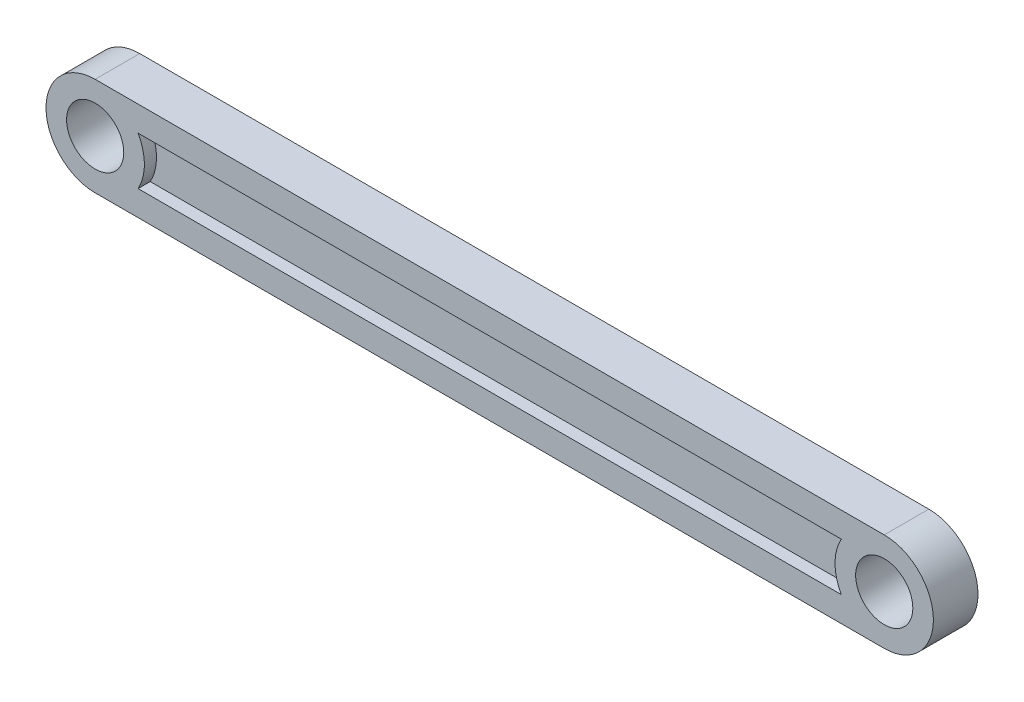
ISO-10303-21;
HEADER;
FILE_DESCRIPTION(('STEP AP214'),'2;1');
FILE_NAME('part.step','',(''),(''),'','','');
FILE_SCHEMA(('AUTOMOTIVE_DESIGN { 1 0 10303 214 1 1 1 1 }'));
ENDSEC;
DATA;
#1=APPLICATION_CONTEXT('core data for automotive mechanical design processes');
#2=APPLICATION_PROTOCOL_DEFINITION('international standard','automotive_design',2000,#1);
#3=PRODUCT_CONTEXT('',#1,'mechanical');
#4=PRODUCT('Part','Part','',(#3));
#5=PRODUCT_RELATED_PRODUCT_CATEGORY('part','',(#4));
#6=PRODUCT_DEFINITION_FORMATION('','',#4);
#7=PRODUCT_DEFINITION_CONTEXT('part definition',#1,'design');
#8=PRODUCT_DEFINITION('design','',#6,#7);
#9=PRODUCT_DEFINITION_SHAPE('','',#8);
#10=(LENGTH_UNIT() NAMED_UNIT(*) SI_UNIT(.MILLI.,.METRE.));
#11=(NAMED_UNIT(*) PLANE_ANGLE_UNIT() SI_UNIT($,.RADIAN.));
#12=(NAMED_UNIT(*) SI_UNIT($,.STERADIAN.) SOLID_ANGLE_UNIT());
#13=UNCERTAINTY_MEASURE_WITH_UNIT(LENGTH_MEASURE(1.E-05),#10,'distance_accuracy_value','');
#14=(GEOMETRIC_REPRESENTATION_CONTEXT(3) GLOBAL_UNCERTAINTY_ASSIGNED_CONTEXT((#13)) GLOBAL_UNIT_ASSIGNED_CONTEXT((#10,
#11,#12)) REPRESENTATION_CONTEXT('',''));
#15=CARTESIAN_POINT('',(0.,0.,0.));
#16=DIRECTION('',(0.,0.,1.));
#17=DIRECTION('',(1.,0.,0.));
#18=AXIS2_PLACEMENT_3D('',#15,#16,#17);
#19=CARTESIAN_POINT('',(34.5,0.,1.95));
#20=DIRECTION('',(0.,0.,1.));
#21=DIRECTION('',(1.,0.,0.));
#22=AXIS2_PLACEMENT_3D('',#19,#20,#21);
#23=PLANE('',#22);
#24=CARTESIAN_POINT('',(-34.5,0.,1.95));
#25=DIRECTION('',(0.,0.,1.));
#26=DIRECTION('',(1.,0.,0.));
#27=AXIS2_PLACEMENT_3D('',#24,#25,#26);
#28=CIRCLE('',#27,2.5);
#29=CARTESIAN_POINT('',(-32.,0.,1.95));
#30=VERTEX_POINT('',#29);
#31=EDGE_CURVE('E227',#30,#30,#28,.T.);
#32=ORIENTED_EDGE('',*,*,#31,.F.);
#33=EDGE_LOOP('',(#32));
#34=FACE_BOUND('',#33,.T.);
#35=CARTESIAN_POINT('',(34.5,0.,1.95));
#36=DIRECTION('',(0.,0.,1.));
#37=DIRECTION('',(1.,0.,0.));
#38=AXIS2_PLACEMENT_3D('',#35,#36,#37);
#39=CIRCLE('',#38,4.3);
#40=CARTESIAN_POINT('',(34.5,-4.29999999999999,1.95));
#41=VERTEX_POINT('',#40);
#42=CARTESIAN_POINT('',(34.5,4.30000000000001,1.95));
#43=VERTEX_POINT('',#42);
#44=EDGE_CURVE('E235',#41,#43,#39,.T.);
#45=ORIENTED_EDGE('',*,*,#44,.T.);
#46=DIRECTION('',(-1.,0.,0.));
#47=VECTOR('',#46,1.);
#48=CARTESIAN_POINT('',(34.5,4.30000000000001,1.95));
#49=LINE('',#48,#47);
#50=CARTESIAN_POINT('',(-34.5,4.29999999999999,1.95));
#51=VERTEX_POINT('',#50);
#52=EDGE_CURVE('E239',#43,#51,#49,.T.);
#53=ORIENTED_EDGE('',*,*,#52,.T.);
#54=CARTESIAN_POINT('',(-34.5,0.,1.95));
#55=DIRECTION('',(0.,0.,1.));
#56=DIRECTION('',(1.,0.,0.));
#57=AXIS2_PLACEMENT_3D('',#54,#55,#56);
#58=CIRCLE('',#57,4.3);
#59=CARTESIAN_POINT('',(-34.5,-4.30000000000001,1.95));
#60=VERTEX_POINT('',#59);
#61=EDGE_CURVE('E243',#51,#60,#58,.T.);
#62=ORIENTED_EDGE('',*,*,#61,.T.);
#63=DIRECTION('',(1.,0.,0.));
#64=VECTOR('',#63,1.);
#65=CARTESIAN_POINT('',(34.5,-4.29999999999999,1.95));
#66=LINE('',#65,#64);
#67=EDGE_CURVE('E246',#60,#41,#66,.T.);
#68=ORIENTED_EDGE('',*,*,#67,.T.);
#69=EDGE_LOOP('',(#45,#53,#62,#68));
#70=FACE_BOUND('',#69,.T.);
#71=CARTESIAN_POINT('',(34.5,0.,1.95));
#72=DIRECTION('',(0.,0.,1.));
#73=DIRECTION('',(1.,0.,0.));
#74=AXIS2_PLACEMENT_3D('',#71,#72,#73);
#75=CIRCLE('',#74,2.5);
#76=CARTESIAN_POINT('',(37.,0.,1.95));
#77=VERTEX_POINT('',#76);
#78=EDGE_CURVE('E219',#77,#77,#75,.T.);
#79=ORIENTED_EDGE('',*,*,#78,.F.);
#80=EDGE_LOOP('',(#79));
#81=FACE_BOUND('',#80,.T.);
#82=DIRECTION('',(-1.,0.,0.));
#83=VECTOR('',#82,1.);
#84=CARTESIAN_POINT('',(0.,2.1,1.95));
#85=LINE('',#84,#83);
#86=CARTESIAN_POINT('',(30.7476673921413,2.10000000000001,1.95));
#87=VERTEX_POINT('',#86);
#88=CARTESIAN_POINT('',(-30.7476673921413,2.09999999999999,1.95));
#89=VERTEX_POINT('',#88);
#90=EDGE_CURVE('E196',#87,#89,#85,.T.);
#91=ORIENTED_EDGE('',*,*,#90,.F.);
#92=CARTESIAN_POINT('',(34.5,0.,1.95));
#93=DIRECTION('',(0.,0.,1.));
#94=DIRECTION('',(1.,0.,0.));
#95=AXIS2_PLACEMENT_3D('',#92,#93,#94);
#96=CIRCLE('',#95,4.3);
#97=CARTESIAN_POINT('',(30.7476673921413,-2.09999999999999,1.95));
#98=VERTEX_POINT('',#97);
#99=EDGE_CURVE('E63',#87,#98,#96,.T.);
#100=ORIENTED_EDGE('',*,*,#99,.T.);
#101=DIRECTION('',(1.,0.,0.));
#102=VECTOR('',#101,1.);
#103=CARTESIAN_POINT('',(0.,-2.1,1.95));
#104=LINE('',#103,#102);
#105=CARTESIAN_POINT('',(-30.7476673921413,-2.10000000000001,1.95));
#106=VERTEX_POINT('',#105);
#107=EDGE_CURVE('E182',#106,#98,#104,.T.);
#108=ORIENTED_EDGE('',*,*,#107,.F.);
#109=CARTESIAN_POINT('',(-34.5,0.,1.95));
#110=DIRECTION('',(0.,0.,1.));
#111=DIRECTION('',(1.,0.,0.));
#112=AXIS2_PLACEMENT_3D('',#109,#110,#111);
#113=CIRCLE('',#112,4.3);
#114=EDGE_CURVE('E200',#106,#89,#113,.T.);
#115=ORIENTED_EDGE('',*,*,#114,.T.);
#116=EDGE_LOOP('',(#91,#100,#108,#115));
#117=FACE_BOUND('',#116,.T.);
#118=ADVANCED_FACE('F39',(#34,#70,#81,#117),#23,.T.);
#119=CARTESIAN_POINT('',(34.5,0.,-1.95));
#120=DIRECTION('',(0.,0.,1.));
#121=DIRECTION('',(1.,0.,0.));
#122=AXIS2_PLACEMENT_3D('',#119,#120,#121);
#123=PLANE('',#122);
#124=DIRECTION('',(1.,0.,0.));
#125=VECTOR('',#124,1.);
#126=CARTESIAN_POINT('',(0.,-2.1,-1.95));
#127=LINE('',#126,#125);
#128=CARTESIAN_POINT('',(-30.7476673921413,-2.10000000000001,-1.95));
#129=VERTEX_POINT('',#128);
#130=CARTESIAN_POINT('',(30.7476673921413,-2.09999999999999,-1.95));
#131=VERTEX_POINT('',#130);
#132=EDGE_CURVE('E164',#129,#131,#127,.T.);
#133=ORIENTED_EDGE('',*,*,#132,.T.);
#134=CARTESIAN_POINT('',(34.5,0.,-1.95));
#135=DIRECTION('',(0.,0.,1.));
#136=DIRECTION('',(1.,0.,0.));
#137=AXIS2_PLACEMENT_3D('',#134,#135,#136);
#138=CIRCLE('',#137,4.3);
#139=CARTESIAN_POINT('',(30.7476673921413,2.10000000000001,-1.95));
#140=VERTEX_POINT('',#139);
#141=EDGE_CURVE('E55',#140,#131,#138,.T.);
#142=ORIENTED_EDGE('',*,*,#141,.F.);
#143=DIRECTION('',(-1.,0.,0.));
#144=VECTOR('',#143,1.);
#145=CARTESIAN_POINT('',(0.,2.1,-1.95));
#146=LINE('',#145,#144);
#147=CARTESIAN_POINT('',(-30.7476673921413,2.09999999999999,-1.95));
#148=VERTEX_POINT('',#147);
#149=EDGE_CURVE('E151',#140,#148,#146,.T.);
#150=ORIENTED_EDGE('',*,*,#149,.T.);
#151=CARTESIAN_POINT('',(-34.5,0.,-1.95));
#152=DIRECTION('',(0.,0.,1.));
#153=DIRECTION('',(1.,0.,0.));
#154=AXIS2_PLACEMENT_3D('',#151,#152,#153);
#155=CIRCLE('',#154,4.3);
#156=EDGE_CURVE('E155',#129,#148,#155,.T.);
#157=ORIENTED_EDGE('',*,*,#156,.F.);
#158=EDGE_LOOP('',(#133,#142,#150,#157));
#159=FACE_BOUND('',#158,.T.);
#160=CARTESIAN_POINT('',(34.5,0.,-1.95));
#161=DIRECTION('',(0.,0.,1.));
#162=DIRECTION('',(1.,0.,0.));
#163=AXIS2_PLACEMENT_3D('',#160,#161,#162);
#164=CIRCLE('',#163,4.3);
#165=CARTESIAN_POINT('',(34.5,-4.29999999999999,-1.95));
#166=VERTEX_POINT('',#165);
#167=CARTESIAN_POINT('',(34.5,4.30000000000001,-1.95));
#168=VERTEX_POINT('',#167);
#169=EDGE_CURVE('E231',#166,#168,#164,.T.);
#170=ORIENTED_EDGE('',*,*,#169,.F.);
#171=DIRECTION('',(1.,0.,0.));
#172=VECTOR('',#171,1.);
#173=CARTESIAN_POINT('',(34.5,-4.29999999999999,-1.95));
#174=LINE('',#173,#172);
#175=CARTESIAN_POINT('',(-34.5,-4.30000000000001,-1.95));
#176=VERTEX_POINT('',#175);
#177=EDGE_CURVE('E240',#176,#166,#174,.T.);
#178=ORIENTED_EDGE('',*,*,#177,.F.);
#179=CARTESIAN_POINT('',(-34.5,0.,-1.95));
#180=DIRECTION('',(0.,0.,1.));
#181=DIRECTION('',(1.,0.,0.));
#182=AXIS2_PLACEMENT_3D('',#179,#180,#181);
#183=CIRCLE('',#182,4.3);
#184=CARTESIAN_POINT('',(-34.5,4.29999999999999,-1.95));
#185=VERTEX_POINT('',#184);
#186=EDGE_CURVE('E256',#185,#176,#183,.T.);
#187=ORIENTED_EDGE('',*,*,#186,.F.);
#188=DIRECTION('',(-1.,0.,0.));
#189=VECTOR('',#188,1.);
#190=CARTESIAN_POINT('',(34.5,4.30000000000001,-1.95));
#191=LINE('',#190,#189);
#192=EDGE_CURVE('E253',#168,#185,#191,.T.);
#193=ORIENTED_EDGE('',*,*,#192,.F.);
#194=EDGE_LOOP('',(#170,#178,#187,#193));
#195=FACE_BOUND('',#194,.T.);
#196=CARTESIAN_POINT('',(-34.5,0.,-1.95));
#197=DIRECTION('',(0.,0.,1.));
#198=DIRECTION('',(1.,0.,0.));
#199=AXIS2_PLACEMENT_3D('',#196,#197,#198);
#200=CIRCLE('',#199,2.5);
#201=CARTESIAN_POINT('',(-32.,0.,-1.95));
#202=VERTEX_POINT('',#201);
#203=EDGE_CURVE('E223',#202,#202,#200,.T.);
#204=ORIENTED_EDGE('',*,*,#203,.T.);
#205=EDGE_LOOP('',(#204));
#206=FACE_BOUND('',#205,.T.);
#207=CARTESIAN_POINT('',(34.5,0.,-1.95));
#208=DIRECTION('',(0.,0.,1.));
#209=DIRECTION('',(1.,0.,0.));
#210=AXIS2_PLACEMENT_3D('',#207,#208,#209);
#211=CIRCLE('',#210,2.5);
#212=CARTESIAN_POINT('',(37.,0.,-1.95));
#213=VERTEX_POINT('',#212);
#214=EDGE_CURVE('E210',#213,#213,#211,.T.);
#215=ORIENTED_EDGE('',*,*,#214,.T.);
#216=EDGE_LOOP('',(#215));
#217=FACE_BOUND('',#216,.T.);
#218=ADVANCED_FACE('F279',(#159,#195,#206,#217),#123,.F.);
#219=CARTESIAN_POINT('',(34.5,0.,1.95));
#220=DIRECTION('',(0.,0.,-1.));
#221=DIRECTION('',(-1.,0.,0.));
#222=AXIS2_PLACEMENT_3D('',#219,#220,#221);
#223=CYLINDRICAL_SURFACE('',#222,4.3);
#224=ORIENTED_EDGE('',*,*,#169,.T.);
#225=DIRECTION('',(0.,0.,-1.));
#226=VECTOR('',#225,1.);
#227=CARTESIAN_POINT('',(34.5,4.30000000000001,1.95));
#228=LINE('',#227,#226);
#229=EDGE_CURVE('E11',#43,#168,#228,.T.);
#230=ORIENTED_EDGE('',*,*,#229,.F.);
#231=ORIENTED_EDGE('',*,*,#44,.F.);
#232=DIRECTION('',(0.,0.,-1.));
#233=VECTOR('',#232,1.);
#234=CARTESIAN_POINT('',(34.5,-4.29999999999999,1.95));
#235=LINE('',#234,#233);
#236=EDGE_CURVE('E249',#41,#166,#235,.T.);
#237=ORIENTED_EDGE('',*,*,#236,.T.);
#238=EDGE_LOOP('',(#224,#230,#231,#237));
#239=FACE_BOUND('',#238,.T.);
#240=ADVANCED_FACE('F41',(#239),#223,.T.);
#241=CARTESIAN_POINT('',(34.5,4.30000000000001,1.95));
#242=DIRECTION('',(0.,-1.,0.));
#243=DIRECTION('',(1.,0.,0.));
#244=AXIS2_PLACEMENT_3D('',#241,#242,#243);
#245=PLANE('',#244);
#246=ORIENTED_EDGE('',*,*,#192,.T.);
#247=DIRECTION('',(0.,0.,-1.));
#248=VECTOR('',#247,1.);
#249=CARTESIAN_POINT('',(-34.5,4.29999999999999,1.95));
#250=LINE('',#249,#248);
#251=EDGE_CURVE('E48',#51,#185,#250,.T.);
#252=ORIENTED_EDGE('',*,*,#251,.F.);
#253=ORIENTED_EDGE('',*,*,#52,.F.);
#254=ORIENTED_EDGE('',*,*,#229,.T.);
#255=EDGE_LOOP('',(#246,#252,#253,#254));
#256=FACE_BOUND('',#255,.T.);
#257=ADVANCED_FACE('F290',(#256),#245,.F.);
#258=CARTESIAN_POINT('',(-34.5,0.,1.95));
#259=DIRECTION('',(0.,0.,-1.));
#260=DIRECTION('',(-1.,0.,0.));
#261=AXIS2_PLACEMENT_3D('',#258,#259,#260);
#262=CYLINDRICAL_SURFACE('',#261,4.3);
#263=ORIENTED_EDGE('',*,*,#186,.T.);
#264=DIRECTION('',(0.,0.,-1.));
#265=VECTOR('',#264,1.);
#266=CARTESIAN_POINT('',(-34.5,-4.30000000000001,1.95));
#267=LINE('',#266,#265);
#268=EDGE_CURVE('E264',#60,#176,#267,.T.);
#269=ORIENTED_EDGE('',*,*,#268,.F.);
#270=ORIENTED_EDGE('',*,*,#61,.F.);
#271=ORIENTED_EDGE('',*,*,#251,.T.);
#272=EDGE_LOOP('',(#263,#269,#270,#271));
#273=FACE_BOUND('',#272,.T.);
#274=ADVANCED_FACE('F273',(#273),#262,.T.);
#275=CARTESIAN_POINT('',(34.5,-4.29999999999999,1.95));
#276=DIRECTION('',(0.,1.,0.));
#277=DIRECTION('',(-1.,0.,0.));
#278=AXIS2_PLACEMENT_3D('',#275,#276,#277);
#279=PLANE('',#278);
#280=ORIENTED_EDGE('',*,*,#177,.T.);
#281=ORIENTED_EDGE('',*,*,#236,.F.);
#282=ORIENTED_EDGE('',*,*,#67,.F.);
#283=ORIENTED_EDGE('',*,*,#268,.T.);
#284=EDGE_LOOP('',(#280,#281,#282,#283));
#285=FACE_BOUND('',#284,.T.);
#286=ADVANCED_FACE('F283',(#285),#279,.F.);
#287=CARTESIAN_POINT('',(-34.5,0.,1.95));
#288=DIRECTION('',(0.,0.,-1.));
#289=DIRECTION('',(-1.,0.,0.));
#290=AXIS2_PLACEMENT_3D('',#287,#288,#289);
#291=CYLINDRICAL_SURFACE('',#290,2.5);
#292=ORIENTED_EDGE('',*,*,#31,.T.);
#293=EDGE_LOOP('',(#292));
#294=FACE_BOUND('',#293,.T.);
#295=ORIENTED_EDGE('',*,*,#203,.F.);
#296=EDGE_LOOP('',(#295));
#297=FACE_BOUND('',#296,.T.);
#298=ADVANCED_FACE('F307',(#294,#297),#291,.F.);
#299=CARTESIAN_POINT('',(34.5,0.,1.95));
#300=DIRECTION('',(0.,0.,-1.));
#301=DIRECTION('',(-1.,0.,0.));
#302=AXIS2_PLACEMENT_3D('',#299,#300,#301);
#303=CYLINDRICAL_SURFACE('',#302,2.5);
#304=ORIENTED_EDGE('',*,*,#78,.T.);
#305=EDGE_LOOP('',(#304));
#306=FACE_BOUND('',#305,.T.);
#307=ORIENTED_EDGE('',*,*,#214,.F.);
#308=EDGE_LOOP('',(#307));
#309=FACE_BOUND('',#308,.T.);
#310=ADVANCED_FACE('F314',(#306,#309),#303,.F.);
#311=CARTESIAN_POINT('',(34.5,0.,0.89));
#312=DIRECTION('',(0.,0.,1.));
#313=DIRECTION('',(1.,0.,0.));
#314=AXIS2_PLACEMENT_3D('',#311,#312,#313);
#315=CYLINDRICAL_SURFACE('',#314,4.3);
#316=ORIENTED_EDGE('',*,*,#99,.F.);
#317=DIRECTION('',(0.,0.,1.));
#318=VECTOR('',#317,1.);
#319=CARTESIAN_POINT('',(30.7476673921413,2.10000000000001,0.89));
#320=LINE('',#319,#318);
#321=CARTESIAN_POINT('',(30.7476673921413,2.10000000000001,0.89));
#322=VERTEX_POINT('',#321);
#323=EDGE_CURVE('E193',#322,#87,#320,.T.);
#324=ORIENTED_EDGE('',*,*,#323,.F.);
#325=CARTESIAN_POINT('',(34.5,0.,0.89));
#326=DIRECTION('',(0.,0.,1.));
#327=DIRECTION('',(1.,0.,0.));
#328=AXIS2_PLACEMENT_3D('',#325,#326,#327);
#329=CIRCLE('',#328,4.3);
#330=CARTESIAN_POINT('',(30.7476673921413,-2.09999999999999,0.89));
#331=VERTEX_POINT('',#330);
#332=EDGE_CURVE('E178',#322,#331,#329,.T.);
#333=ORIENTED_EDGE('',*,*,#332,.T.);
#334=DIRECTION('',(0.,0.,1.));
#335=VECTOR('',#334,1.);
#336=CARTESIAN_POINT('',(30.7476673921413,-2.09999999999999,0.89));
#337=LINE('',#336,#335);
#338=EDGE_CURVE('E207',#331,#98,#337,.T.);
#339=ORIENTED_EDGE('',*,*,#338,.T.);
#340=EDGE_LOOP('',(#316,#324,#333,#339));
#341=FACE_BOUND('',#340,.T.);
#342=ADVANCED_FACE('F319',(#341),#315,.T.);
#343=CARTESIAN_POINT('',(0.,-2.1,0.89));
#344=DIRECTION('',(0.,-1.,0.));
#345=DIRECTION('',(1.,0.,0.));
#346=AXIS2_PLACEMENT_3D('',#343,#344,#345);
#347=PLANE('',#346);
#348=ORIENTED_EDGE('',*,*,#107,.T.);
#349=ORIENTED_EDGE('',*,*,#338,.F.);
#350=DIRECTION('',(1.,0.,0.));
#351=VECTOR('',#350,1.);
#352=CARTESIAN_POINT('',(0.,-2.1,0.89));
#353=LINE('',#352,#351);
#354=CARTESIAN_POINT('',(-30.7476673921413,-2.10000000000001,0.89));
#355=VERTEX_POINT('',#354);
#356=EDGE_CURVE('E189',#355,#331,#353,.T.);
#357=ORIENTED_EDGE('',*,*,#356,.F.);
#358=DIRECTION('',(0.,0.,1.));
#359=VECTOR('',#358,1.);
#360=CARTESIAN_POINT('',(-30.7476673921413,-2.10000000000001,0.89));
#361=LINE('',#360,#359);
#362=EDGE_CURVE('E211',#355,#106,#361,.T.);
#363=ORIENTED_EDGE('',*,*,#362,.T.);
#364=EDGE_LOOP('',(#348,#349,#357,#363));
#365=FACE_BOUND('',#364,.T.);
#366=ADVANCED_FACE('F329',(#365),#347,.F.);
#367=CARTESIAN_POINT('',(-34.5,0.,0.89));
#368=DIRECTION('',(0.,0.,1.));
#369=DIRECTION('',(1.,0.,0.));
#370=AXIS2_PLACEMENT_3D('',#367,#368,#369);
#371=CYLINDRICAL_SURFACE('',#370,4.3);
#372=ORIENTED_EDGE('',*,*,#114,.F.);
#373=ORIENTED_EDGE('',*,*,#362,.F.);
#374=CARTESIAN_POINT('',(-34.5,0.,0.89));
#375=DIRECTION('',(0.,0.,1.));
#376=DIRECTION('',(1.,0.,0.));
#377=AXIS2_PLACEMENT_3D('',#374,#375,#376);
#378=CIRCLE('',#377,4.3);
#379=CARTESIAN_POINT('',(-30.7476673921413,2.09999999999999,0.89));
#380=VERTEX_POINT('',#379);
#381=EDGE_CURVE('E186',#355,#380,#378,.T.);
#382=ORIENTED_EDGE('',*,*,#381,.T.);
#383=DIRECTION('',(0.,0.,1.));
#384=VECTOR('',#383,1.);
#385=CARTESIAN_POINT('',(-30.7476673921413,2.09999999999999,0.89));
#386=LINE('',#385,#384);
#387=EDGE_CURVE('E214',#380,#89,#386,.T.);
#388=ORIENTED_EDGE('',*,*,#387,.T.);
#389=EDGE_LOOP('',(#372,#373,#382,#388));
#390=FACE_BOUND('',#389,.T.);
#391=ADVANCED_FACE('F336',(#390),#371,.T.);
#392=CARTESIAN_POINT('',(0.,2.1,0.89));
#393=DIRECTION('',(0.,1.,0.));
#394=DIRECTION('',(-1.,0.,0.));
#395=AXIS2_PLACEMENT_3D('',#392,#393,#394);
#396=PLANE('',#395);
#397=ORIENTED_EDGE('',*,*,#90,.T.);
#398=ORIENTED_EDGE('',*,*,#387,.F.);
#399=DIRECTION('',(-1.,0.,0.));
#400=VECTOR('',#399,1.);
#401=CARTESIAN_POINT('',(0.,2.1,0.89));
#402=LINE('',#401,#400);
#403=EDGE_CURVE('E181',#322,#380,#402,.T.);
#404=ORIENTED_EDGE('',*,*,#403,.F.);
#405=ORIENTED_EDGE('',*,*,#323,.T.);
#406=EDGE_LOOP('',(#397,#398,#404,#405));
#407=FACE_BOUND('',#406,.T.);
#408=ADVANCED_FACE('F332',(#407),#396,.F.);
#409=CARTESIAN_POINT('',(0.,0.,0.89));
#410=DIRECTION('',(0.,0.,1.));
#411=DIRECTION('',(1.,0.,0.));
#412=AXIS2_PLACEMENT_3D('',#409,#410,#411);
#413=PLANE('',#412);
#414=ORIENTED_EDGE('',*,*,#332,.F.);
#415=ORIENTED_EDGE('',*,*,#403,.T.);
#416=ORIENTED_EDGE('',*,*,#381,.F.);
#417=ORIENTED_EDGE('',*,*,#356,.T.);
#418=EDGE_LOOP('',(#414,#415,#416,#417));
#419=FACE_BOUND('',#418,.T.);
#420=ADVANCED_FACE('F335',(#419),#413,.T.);
#421=CARTESIAN_POINT('',(34.5,0.,-0.89));
#422=DIRECTION('',(0.,0.,-1.));
#423=DIRECTION('',(-1.,0.,0.));
#424=AXIS2_PLACEMENT_3D('',#421,#422,#423);
#425=CYLINDRICAL_SURFACE('',#424,4.3);
#426=ORIENTED_EDGE('',*,*,#141,.T.);
#427=DIRECTION('',(0.,0.,-1.));
#428=VECTOR('',#427,1.);
#429=CARTESIAN_POINT('',(30.7476673921413,-2.09999999999999,-0.89));
#430=LINE('',#429,#428);
#431=CARTESIAN_POINT('',(30.7476673921413,-2.09999999999999,-0.89));
#432=VERTEX_POINT('',#431);
#433=EDGE_CURVE('E132',#432,#131,#430,.T.);
#434=ORIENTED_EDGE('',*,*,#433,.F.);
#435=CARTESIAN_POINT('',(34.5,0.,-0.89));
#436=DIRECTION('',(0.,0.,1.));
#437=DIRECTION('',(1.,0.,0.));
#438=AXIS2_PLACEMENT_3D('',#435,#436,#437);
#439=CIRCLE('',#438,4.3);
#440=CARTESIAN_POINT('',(30.7476673921413,2.10000000000001,-0.89));
#441=VERTEX_POINT('',#440);
#442=EDGE_CURVE('E141',#441,#432,#439,.T.);
#443=ORIENTED_EDGE('',*,*,#442,.F.);
#444=DIRECTION('',(0.,0.,-1.));
#445=VECTOR('',#444,1.);
#446=CARTESIAN_POINT('',(30.7476673921413,2.10000000000001,-0.89));
#447=LINE('',#446,#445);
#448=EDGE_CURVE('E170',#441,#140,#447,.T.);
#449=ORIENTED_EDGE('',*,*,#448,.T.);
#450=EDGE_LOOP('',(#426,#434,#443,#449));
#451=FACE_BOUND('',#450,.T.);
#452=ADVANCED_FACE('F144',(#451),#425,.T.);
#453=CARTESIAN_POINT('',(0.,2.1,-0.89));
#454=DIRECTION('',(0.,-1.,0.));
#455=DIRECTION('',(1.,0.,0.));
#456=AXIS2_PLACEMENT_3D('',#453,#454,#455);
#457=PLANE('',#456);
#458=ORIENTED_EDGE('',*,*,#149,.F.);
#459=ORIENTED_EDGE('',*,*,#448,.F.);
#460=DIRECTION('',(-1.,0.,0.));
#461=VECTOR('',#460,1.);
#462=CARTESIAN_POINT('',(0.,2.1,-0.89));
#463=LINE('',#462,#461);
#464=CARTESIAN_POINT('',(-30.7476673921413,2.09999999999999,-0.89));
#465=VERTEX_POINT('',#464);
#466=EDGE_CURVE('E146',#441,#465,#463,.T.);
#467=ORIENTED_EDGE('',*,*,#466,.T.);
#468=DIRECTION('',(0.,0.,-1.));
#469=VECTOR('',#468,1.);
#470=CARTESIAN_POINT('',(-30.7476673921413,2.09999999999999,-0.89));
#471=LINE('',#470,#469);
#472=EDGE_CURVE('E173',#465,#148,#471,.T.);
#473=ORIENTED_EDGE('',*,*,#472,.T.);
#474=EDGE_LOOP('',(#458,#459,#467,#473));
#475=FACE_BOUND('',#474,.T.);
#476=ADVANCED_FACE('F349',(#475),#457,.T.);
#477=CARTESIAN_POINT('',(-34.5,0.,-0.89));
#478=DIRECTION('',(0.,0.,-1.));
#479=DIRECTION('',(-1.,0.,0.));
#480=AXIS2_PLACEMENT_3D('',#477,#478,#479);
#481=CYLINDRICAL_SURFACE('',#480,4.3);
#482=ORIENTED_EDGE('',*,*,#156,.T.);
#483=ORIENTED_EDGE('',*,*,#472,.F.);
#484=CARTESIAN_POINT('',(-34.5,0.,-0.89));
#485=DIRECTION('',(0.,0.,1.));
#486=DIRECTION('',(1.,0.,0.));
#487=AXIS2_PLACEMENT_3D('',#484,#485,#486);
#488=CIRCLE('',#487,4.3);
#489=CARTESIAN_POINT('',(-30.7476673921413,-2.10000000000001,-0.89));
#490=VERTEX_POINT('',#489);
#491=EDGE_CURVE('E140',#490,#465,#488,.T.);
#492=ORIENTED_EDGE('',*,*,#491,.F.);
#493=DIRECTION('',(0.,0.,-1.));
#494=VECTOR('',#493,1.);
#495=CARTESIAN_POINT('',(-30.7476673921413,-2.10000000000001,-0.89));
#496=LINE('',#495,#494);
#497=EDGE_CURVE('E134',#490,#129,#496,.T.);
#498=ORIENTED_EDGE('',*,*,#497,.T.);
#499=EDGE_LOOP('',(#482,#483,#492,#498));
#500=FACE_BOUND('',#499,.T.);
#501=ADVANCED_FACE('F352',(#500),#481,.T.);
#502=CARTESIAN_POINT('',(0.,-2.1,-0.89));
#503=DIRECTION('',(0.,1.,0.));
#504=DIRECTION('',(-1.,0.,0.));
#505=AXIS2_PLACEMENT_3D('',#502,#503,#504);
#506=PLANE('',#505);
#507=ORIENTED_EDGE('',*,*,#132,.F.);
#508=ORIENTED_EDGE('',*,*,#497,.F.);
#509=DIRECTION('',(1.,0.,0.));
#510=VECTOR('',#509,1.);
#511=CARTESIAN_POINT('',(0.,-2.1,-0.89));
#512=LINE('',#511,#510);
#513=EDGE_CURVE('E129',#490,#432,#512,.T.);
#514=ORIENTED_EDGE('',*,*,#513,.T.);
#515=ORIENTED_EDGE('',*,*,#433,.T.);
#516=EDGE_LOOP('',(#507,#508,#514,#515));
#517=FACE_BOUND('',#516,.T.);
#518=ADVANCED_FACE('F131',(#517),#506,.T.);
#519=CARTESIAN_POINT('',(0.,0.,-0.89));
#520=DIRECTION('',(0.,0.,-1.));
#521=DIRECTION('',(1.,0.,0.));
#522=AXIS2_PLACEMENT_3D('',#519,#520,#521);
#523=PLANE('',#522);
#524=ORIENTED_EDGE('',*,*,#442,.T.);
#525=ORIENTED_EDGE('',*,*,#513,.F.);
#526=ORIENTED_EDGE('',*,*,#491,.T.);
#527=ORIENTED_EDGE('',*,*,#466,.F.);
#528=EDGE_LOOP('',(#524,#525,#526,#527));
#529=FACE_BOUND('',#528,.T.);
#530=ADVANCED_FACE('F149',(#529),#523,.T.);
#531=CLOSED_SHELL('',(#118,#218,#240,#257,#274,#286,#298,#310,#342,#366,#391,#408,#420,#452,
#476,#501,#518,#530));
#532=MANIFOLD_SOLID_BREP('B2',#531);
#533=ADVANCED_BREP_SHAPE_REPRESENTATION('',(#18,#532),#14);
#534=SHAPE_DEFINITION_REPRESENTATION(#9,#533);
ENDSEC;
END-ISO-10303-21;
